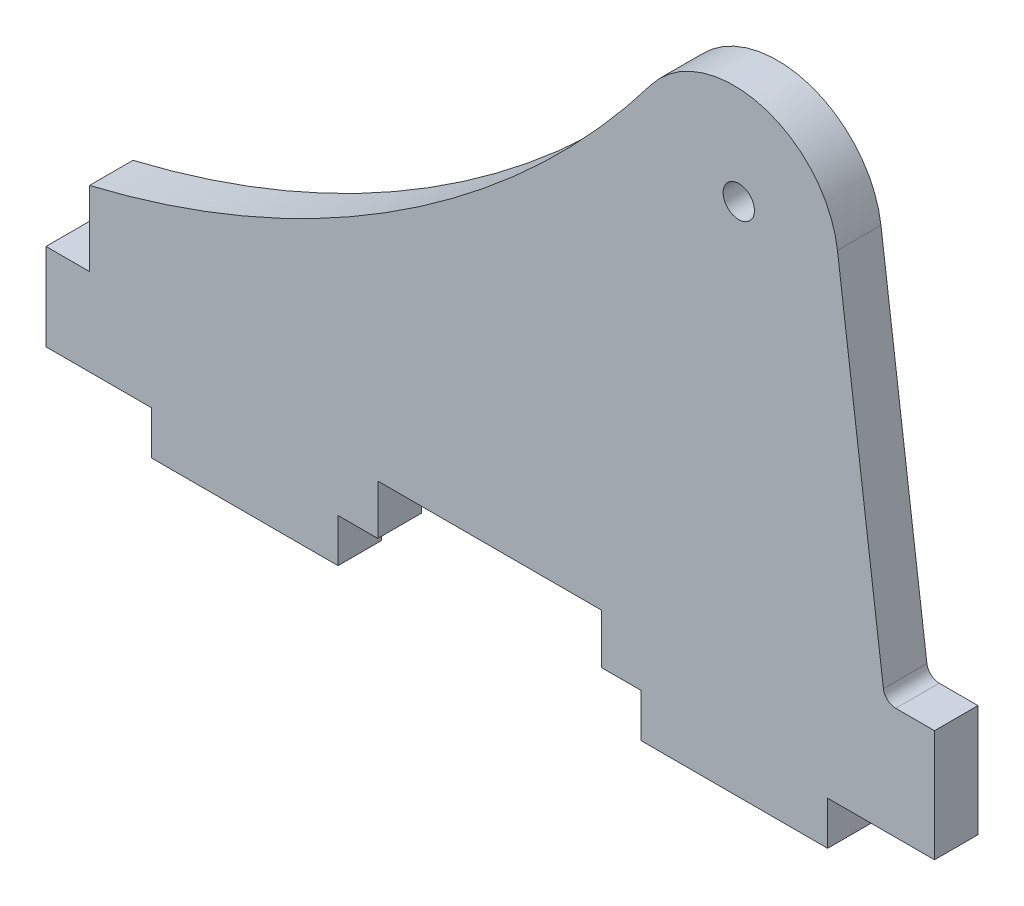
ISO-10303-21;
HEADER;
FILE_DESCRIPTION(('STEP AP214'),'2;1');
FILE_NAME('part.step','',(''),(''),'','','');
FILE_SCHEMA(('AUTOMOTIVE_DESIGN { 1 0 10303 214 1 1 1 1 }'));
ENDSEC;
DATA;
#1=APPLICATION_CONTEXT('core data for automotive mechanical design processes');
#2=APPLICATION_PROTOCOL_DEFINITION('international standard','automotive_design',2000,#1);
#3=PRODUCT_CONTEXT('',#1,'mechanical');
#4=PRODUCT('Part','Part','',(#3));
#5=PRODUCT_RELATED_PRODUCT_CATEGORY('part','',(#4));
#6=PRODUCT_DEFINITION_FORMATION('','',#4);
#7=PRODUCT_DEFINITION_CONTEXT('part definition',#1,'design');
#8=PRODUCT_DEFINITION('design','',#6,#7);
#9=PRODUCT_DEFINITION_SHAPE('','',#8);
#10=(LENGTH_UNIT() NAMED_UNIT(*) SI_UNIT(.MILLI.,.METRE.));
#11=(NAMED_UNIT(*) PLANE_ANGLE_UNIT() SI_UNIT($,.RADIAN.));
#12=(NAMED_UNIT(*) SI_UNIT($,.STERADIAN.) SOLID_ANGLE_UNIT());
#13=UNCERTAINTY_MEASURE_WITH_UNIT(LENGTH_MEASURE(1.E-05),#10,'distance_accuracy_value','');
#14=(GEOMETRIC_REPRESENTATION_CONTEXT(3) GLOBAL_UNCERTAINTY_ASSIGNED_CONTEXT((#13)) GLOBAL_UNIT_ASSIGNED_CONTEXT((#10,
#11,#12)) REPRESENTATION_CONTEXT('',''));
#15=CARTESIAN_POINT('',(0.,0.,0.));
#16=DIRECTION('',(0.,0.,1.));
#17=DIRECTION('',(1.,0.,0.));
#18=AXIS2_PLACEMENT_3D('',#15,#16,#17);
#19=CARTESIAN_POINT('',(0.,7.49999999999999,3.5));
#20=DIRECTION('',(0.,1.,0.));
#21=DIRECTION('',(-1.,0.,0.));
#22=AXIS2_PLACEMENT_3D('',#19,#20,#21);
#23=PLANE('',#22);
#24=DIRECTION('',(1.,0.,0.));
#25=VECTOR('',#24,1.);
#26=CARTESIAN_POINT('',(0.,7.49999999999999,0.));
#27=LINE('',#26,#25);
#28=CARTESIAN_POINT('',(26.7,7.5,0.));
#29=VERTEX_POINT('',#28);
#30=CARTESIAN_POINT('',(44.7,7.5,0.));
#31=VERTEX_POINT('',#30);
#32=EDGE_CURVE('E201',#29,#31,#27,.T.);
#33=ORIENTED_EDGE('',*,*,#32,.T.);
#34=DIRECTION('',(0.,0.,-1.));
#35=VECTOR('',#34,1.);
#36=CARTESIAN_POINT('',(44.7,7.5,3.5));
#37=LINE('',#36,#35);
#38=CARTESIAN_POINT('',(44.7,7.5,3.5));
#39=VERTEX_POINT('',#38);
#40=EDGE_CURVE('E199',#39,#31,#37,.T.);
#41=ORIENTED_EDGE('',*,*,#40,.F.);
#42=DIRECTION('',(1.,0.,0.));
#43=VECTOR('',#42,1.);
#44=CARTESIAN_POINT('',(0.,7.49999999999999,3.5));
#45=LINE('',#44,#43);
#46=CARTESIAN_POINT('',(26.7,7.5,3.5));
#47=VERTEX_POINT('',#46);
#48=EDGE_CURVE('E185',#47,#39,#45,.T.);
#49=ORIENTED_EDGE('',*,*,#48,.F.);
#50=DIRECTION('',(0.,0.,-1.));
#51=VECTOR('',#50,1.);
#52=CARTESIAN_POINT('',(26.7,7.5,3.5));
#53=LINE('',#52,#51);
#54=EDGE_CURVE('E255',#47,#29,#53,.T.);
#55=ORIENTED_EDGE('',*,*,#54,.T.);
#56=EDGE_LOOP('',(#33,#41,#49,#55));
#57=FACE_BOUND('',#56,.T.);
#58=ADVANCED_FACE('F36',(#57),#23,.F.);
#59=CARTESIAN_POINT('',(44.7,0.,3.5));
#60=DIRECTION('',(-1.,0.,0.));
#61=DIRECTION('',(0.,-1.,0.));
#62=AXIS2_PLACEMENT_3D('',#59,#60,#61);
#63=PLANE('',#62);
#64=DIRECTION('',(0.,1.,0.));
#65=VECTOR('',#64,1.);
#66=CARTESIAN_POINT('',(44.7,0.,0.));
#67=LINE('',#66,#65);
#68=CARTESIAN_POINT('',(44.7,3.5,0.));
#69=VERTEX_POINT('',#68);
#70=EDGE_CURVE('E257',#69,#31,#67,.T.);
#71=ORIENTED_EDGE('',*,*,#70,.F.);
#72=DIRECTION('',(0.,0.,-1.));
#73=VECTOR('',#72,1.);
#74=CARTESIAN_POINT('',(44.7,3.5,3.5));
#75=LINE('',#74,#73);
#76=CARTESIAN_POINT('',(44.7,3.5,3.5));
#77=VERTEX_POINT('',#76);
#78=EDGE_CURVE('E206',#77,#69,#75,.T.);
#79=ORIENTED_EDGE('',*,*,#78,.F.);
#80=DIRECTION('',(0.,1.,0.));
#81=VECTOR('',#80,1.);
#82=CARTESIAN_POINT('',(44.7,0.,3.5));
#83=LINE('',#82,#81);
#84=EDGE_CURVE('E190',#77,#39,#83,.T.);
#85=ORIENTED_EDGE('',*,*,#84,.T.);
#86=ORIENTED_EDGE('',*,*,#40,.T.);
#87=EDGE_LOOP('',(#71,#79,#85,#86));
#88=FACE_BOUND('',#87,.T.);
#89=ADVANCED_FACE('F208',(#88),#63,.T.);
#90=CARTESIAN_POINT('',(0.,3.5,3.5));
#91=DIRECTION('',(0.,1.,0.));
#92=DIRECTION('',(0.,0.,1.));
#93=AXIS2_PLACEMENT_3D('',#90,#91,#92);
#94=PLANE('',#93);
#95=DIRECTION('',(1.,0.,0.));
#96=VECTOR('',#95,1.);
#97=CARTESIAN_POINT('',(0.,3.5,0.));
#98=LINE('',#97,#96);
#99=CARTESIAN_POINT('',(47.9,3.5,0.));
#100=VERTEX_POINT('',#99);
#101=EDGE_CURVE('E259',#69,#100,#98,.T.);
#102=ORIENTED_EDGE('',*,*,#101,.T.);
#103=DIRECTION('',(0.,0.,-1.));
#104=VECTOR('',#103,1.);
#105=CARTESIAN_POINT('',(47.9,3.5,3.5));
#106=LINE('',#105,#104);
#107=CARTESIAN_POINT('',(47.9,3.5,3.5));
#108=VERTEX_POINT('',#107);
#109=EDGE_CURVE('E348',#108,#100,#106,.T.);
#110=ORIENTED_EDGE('',*,*,#109,.F.);
#111=DIRECTION('',(1.,0.,0.));
#112=VECTOR('',#111,1.);
#113=CARTESIAN_POINT('',(0.,3.5,3.5));
#114=LINE('',#113,#112);
#115=EDGE_CURVE('E210',#77,#108,#114,.T.);
#116=ORIENTED_EDGE('',*,*,#115,.F.);
#117=ORIENTED_EDGE('',*,*,#78,.T.);
#118=EDGE_LOOP('',(#102,#110,#116,#117));
#119=FACE_BOUND('',#118,.T.);
#120=ADVANCED_FACE('F380',(#119),#94,.F.);
#121=CARTESIAN_POINT('',(47.9,0.,3.5));
#122=DIRECTION('',(1.,0.,0.));
#123=DIRECTION('',(0.,0.,-1.));
#124=AXIS2_PLACEMENT_3D('',#121,#122,#123);
#125=PLANE('',#124);
#126=DIRECTION('',(0.,-1.,0.));
#127=VECTOR('',#126,1.);
#128=CARTESIAN_POINT('',(47.9,0.,0.));
#129=LINE('',#128,#127);
#130=CARTESIAN_POINT('',(47.9,0.,0.));
#131=VERTEX_POINT('',#130);
#132=EDGE_CURVE('E261',#100,#131,#129,.T.);
#133=ORIENTED_EDGE('',*,*,#132,.T.);
#134=DIRECTION('',(0.,0.,-1.));
#135=VECTOR('',#134,1.);
#136=CARTESIAN_POINT('',(47.9,0.,3.5));
#137=LINE('',#136,#135);
#138=CARTESIAN_POINT('',(47.9,0.,3.5));
#139=VERTEX_POINT('',#138);
#140=EDGE_CURVE('E345',#139,#131,#137,.T.);
#141=ORIENTED_EDGE('',*,*,#140,.F.);
#142=DIRECTION('',(0.,-1.,0.));
#143=VECTOR('',#142,1.);
#144=CARTESIAN_POINT('',(47.9,0.,3.5));
#145=LINE('',#144,#143);
#146=EDGE_CURVE('E212',#108,#139,#145,.T.);
#147=ORIENTED_EDGE('',*,*,#146,.F.);
#148=ORIENTED_EDGE('',*,*,#109,.T.);
#149=EDGE_LOOP('',(#133,#141,#147,#148));
#150=FACE_BOUND('',#149,.T.);
#151=ADVANCED_FACE('F385',(#150),#125,.F.);
#152=CARTESIAN_POINT('',(0.,0.,3.5));
#153=DIRECTION('',(0.,1.,0.));
#154=DIRECTION('',(0.,0.,1.));
#155=AXIS2_PLACEMENT_3D('',#152,#153,#154);
#156=PLANE('',#155);
#157=DIRECTION('',(1.,0.,0.));
#158=VECTOR('',#157,1.);
#159=CARTESIAN_POINT('',(0.,0.,0.));
#160=LINE('',#159,#158);
#161=CARTESIAN_POINT('',(62.9,0.,0.));
#162=VERTEX_POINT('',#161);
#163=EDGE_CURVE('E263',#131,#162,#160,.T.);
#164=ORIENTED_EDGE('',*,*,#163,.T.);
#165=DIRECTION('',(0.,0.,-1.));
#166=VECTOR('',#165,1.);
#167=CARTESIAN_POINT('',(62.9,0.,3.5));
#168=LINE('',#167,#166);
#169=CARTESIAN_POINT('',(62.9,0.,3.5));
#170=VERTEX_POINT('',#169);
#171=EDGE_CURVE('E342',#170,#162,#168,.T.);
#172=ORIENTED_EDGE('',*,*,#171,.F.);
#173=DIRECTION('',(1.,0.,0.));
#174=VECTOR('',#173,1.);
#175=CARTESIAN_POINT('',(0.,0.,3.5));
#176=LINE('',#175,#174);
#177=EDGE_CURVE('E216',#139,#170,#176,.T.);
#178=ORIENTED_EDGE('',*,*,#177,.F.);
#179=ORIENTED_EDGE('',*,*,#140,.T.);
#180=EDGE_LOOP('',(#164,#172,#178,#179));
#181=FACE_BOUND('',#180,.T.);
#182=ADVANCED_FACE('F389',(#181),#156,.F.);
#183=CARTESIAN_POINT('',(62.9,0.,3.5));
#184=DIRECTION('',(-1.,0.,0.));
#185=DIRECTION('',(0.,0.,1.));
#186=AXIS2_PLACEMENT_3D('',#183,#184,#185);
#187=PLANE('',#186);
#188=DIRECTION('',(0.,1.,0.));
#189=VECTOR('',#188,1.);
#190=CARTESIAN_POINT('',(62.9,0.,0.));
#191=LINE('',#190,#189);
#192=CARTESIAN_POINT('',(62.9,3.5,0.));
#193=VERTEX_POINT('',#192);
#194=EDGE_CURVE('E265',#162,#193,#191,.T.);
#195=ORIENTED_EDGE('',*,*,#194,.T.);
#196=DIRECTION('',(0.,0.,-1.));
#197=VECTOR('',#196,1.);
#198=CARTESIAN_POINT('',(62.9,3.5,3.5));
#199=LINE('',#198,#197);
#200=CARTESIAN_POINT('',(62.9,3.5,3.5));
#201=VERTEX_POINT('',#200);
#202=EDGE_CURVE('E339',#201,#193,#199,.T.);
#203=ORIENTED_EDGE('',*,*,#202,.F.);
#204=DIRECTION('',(0.,1.,0.));
#205=VECTOR('',#204,1.);
#206=CARTESIAN_POINT('',(62.9,0.,3.5));
#207=LINE('',#206,#205);
#208=EDGE_CURVE('E218',#170,#201,#207,.T.);
#209=ORIENTED_EDGE('',*,*,#208,.F.);
#210=ORIENTED_EDGE('',*,*,#171,.T.);
#211=EDGE_LOOP('',(#195,#203,#209,#210));
#212=FACE_BOUND('',#211,.T.);
#213=ADVANCED_FACE('F393',(#212),#187,.F.);
#214=CARTESIAN_POINT('',(0.,3.5,3.5));
#215=DIRECTION('',(0.,1.,0.));
#216=DIRECTION('',(0.,0.,1.));
#217=AXIS2_PLACEMENT_3D('',#214,#215,#216);
#218=PLANE('',#217);
#219=DIRECTION('',(1.,0.,0.));
#220=VECTOR('',#219,1.);
#221=CARTESIAN_POINT('',(0.,3.5,0.));
#222=LINE('',#221,#220);
#223=CARTESIAN_POINT('',(71.5,3.5,0.));
#224=VERTEX_POINT('',#223);
#225=EDGE_CURVE('E267',#193,#224,#222,.T.);
#226=ORIENTED_EDGE('',*,*,#225,.T.);
#227=DIRECTION('',(0.,0.,-1.));
#228=VECTOR('',#227,1.);
#229=CARTESIAN_POINT('',(71.5,3.5,3.5));
#230=LINE('',#229,#228);
#231=CARTESIAN_POINT('',(71.5,3.5,3.5));
#232=VERTEX_POINT('',#231);
#233=EDGE_CURVE('E336',#232,#224,#230,.T.);
#234=ORIENTED_EDGE('',*,*,#233,.F.);
#235=DIRECTION('',(1.,0.,0.));
#236=VECTOR('',#235,1.);
#237=CARTESIAN_POINT('',(0.,3.5,3.5));
#238=LINE('',#237,#236);
#239=EDGE_CURVE('E220',#201,#232,#238,.T.);
#240=ORIENTED_EDGE('',*,*,#239,.F.);
#241=ORIENTED_EDGE('',*,*,#202,.T.);
#242=EDGE_LOOP('',(#226,#234,#240,#241));
#243=FACE_BOUND('',#242,.T.);
#244=ADVANCED_FACE('F397',(#243),#218,.F.);
#245=CARTESIAN_POINT('',(71.5,0.,3.5));
#246=DIRECTION('',(-1.,0.,0.));
#247=DIRECTION('',(0.,0.,1.));
#248=AXIS2_PLACEMENT_3D('',#245,#246,#247);
#249=PLANE('',#248);
#250=DIRECTION('',(0.,1.,0.));
#251=VECTOR('',#250,1.);
#252=CARTESIAN_POINT('',(71.5,0.,0.));
#253=LINE('',#252,#251);
#254=CARTESIAN_POINT('',(71.5,12.5,0.));
#255=VERTEX_POINT('',#254);
#256=EDGE_CURVE('E269',#224,#255,#253,.T.);
#257=ORIENTED_EDGE('',*,*,#256,.T.);
#258=DIRECTION('',(0.,0.,-1.));
#259=VECTOR('',#258,1.);
#260=CARTESIAN_POINT('',(71.5,12.5,3.5));
#261=LINE('',#260,#259);
#262=CARTESIAN_POINT('',(71.5,12.5,3.5));
#263=VERTEX_POINT('',#262);
#264=EDGE_CURVE('E333',#263,#255,#261,.T.);
#265=ORIENTED_EDGE('',*,*,#264,.F.);
#266=DIRECTION('',(0.,1.,0.));
#267=VECTOR('',#266,1.);
#268=CARTESIAN_POINT('',(71.5,0.,3.5));
#269=LINE('',#268,#267);
#270=EDGE_CURVE('E222',#232,#263,#269,.T.);
#271=ORIENTED_EDGE('',*,*,#270,.F.);
#272=ORIENTED_EDGE('',*,*,#233,.T.);
#273=EDGE_LOOP('',(#257,#265,#271,#272));
#274=FACE_BOUND('',#273,.T.);
#275=ADVANCED_FACE('F401',(#274),#249,.F.);
#276=CARTESIAN_POINT('',(0.,12.5,3.5));
#277=DIRECTION('',(0.,-1.,0.));
#278=DIRECTION('',(0.,0.,-1.));
#279=AXIS2_PLACEMENT_3D('',#276,#277,#278);
#280=PLANE('',#279);
#281=DIRECTION('',(-1.,0.,0.));
#282=VECTOR('',#281,1.);
#283=CARTESIAN_POINT('',(0.,12.5,0.));
#284=LINE('',#283,#282);
#285=CARTESIAN_POINT('',(68.3794661772859,12.5,0.));
#286=VERTEX_POINT('',#285);
#287=EDGE_CURVE('E271',#255,#286,#284,.T.);
#288=ORIENTED_EDGE('',*,*,#287,.T.);
#289=DIRECTION('',(0.,0.,-1.));
#290=VECTOR('',#289,1.);
#291=CARTESIAN_POINT('',(68.3794661772859,12.5,3.5));
#292=LINE('',#291,#290);
#293=CARTESIAN_POINT('',(68.3794661772859,12.5,3.5));
#294=VERTEX_POINT('',#293);
#295=EDGE_CURVE('E51',#286,#294,#292,.F.);
#296=ORIENTED_EDGE('',*,*,#295,.T.);
#297=DIRECTION('',(-1.,0.,0.));
#298=VECTOR('',#297,1.);
#299=CARTESIAN_POINT('',(0.,12.5,3.5));
#300=LINE('',#299,#298);
#301=EDGE_CURVE('E224',#263,#294,#300,.T.);
#302=ORIENTED_EDGE('',*,*,#301,.F.);
#303=ORIENTED_EDGE('',*,*,#264,.T.);
#304=EDGE_LOOP('',(#288,#296,#302,#303));
#305=FACE_BOUND('',#304,.T.);
#306=ADVANCED_FACE('F405',(#305),#280,.F.);
#307=CARTESIAN_POINT('',(67.9822446696735,8.75567852598962,3.5));
#308=DIRECTION('',(-0.991807880517906,-0.127738514718855,0.));
#309=DIRECTION('',(0.127738514718855,-0.991807880517906,0.));
#310=AXIS2_PLACEMENT_3D('',#307,#308,#309);
#311=PLANE('',#310);
#312=DIRECTION('',(-0.127738514718855,0.991807880517906,0.));
#313=VECTOR('',#312,1.);
#314=CARTESIAN_POINT('',(67.9822446696735,8.75567852598962,3.5));
#315=LINE('',#314,#313);
#316=CARTESIAN_POINT('',(67.387658296768,13.3722614852811,3.5));
#317=VERTEX_POINT('',#316);
#318=CARTESIAN_POINT('',(63.6911861963504,42.0730035236384,3.5));
#319=VERTEX_POINT('',#318);
#320=EDGE_CURVE('E226',#317,#319,#315,.T.);
#321=ORIENTED_EDGE('',*,*,#320,.F.);
#322=DIRECTION('',(0.,0.,-1.));
#323=VECTOR('',#322,1.);
#324=CARTESIAN_POINT('',(67.387658296768,13.3722614852811,0.));
#325=LINE('',#324,#323);
#326=CARTESIAN_POINT('',(67.387658296768,13.3722614852811,0.));
#327=VERTEX_POINT('',#326);
#328=EDGE_CURVE('E205',#317,#327,#325,.T.);
#329=ORIENTED_EDGE('',*,*,#328,.T.);
#330=DIRECTION('',(-0.127738514718855,0.991807880517906,0.));
#331=VECTOR('',#330,1.);
#332=CARTESIAN_POINT('',(67.9822446696735,8.75567852598962,0.));
#333=LINE('',#332,#331);
#334=CARTESIAN_POINT('',(63.6911861963504,42.0730035236384,0.));
#335=VERTEX_POINT('',#334);
#336=EDGE_CURVE('E273',#327,#335,#333,.T.);
#337=ORIENTED_EDGE('',*,*,#336,.T.);
#338=DIRECTION('',(0.,0.,-1.));
#339=VECTOR('',#338,1.);
#340=CARTESIAN_POINT('',(63.6911861963504,42.0730035236384,3.5));
#341=LINE('',#340,#339);
#342=EDGE_CURVE('E330',#319,#335,#341,.T.);
#343=ORIENTED_EDGE('',*,*,#342,.F.);
#344=EDGE_LOOP('',(#321,#329,#337,#343));
#345=FACE_BOUND('',#344,.T.);
#346=ADVANCED_FACE('F357',(#345),#311,.F.);
#347=CARTESIAN_POINT('',(55.36,41.,3.5));
#348=DIRECTION('',(0.,0.,-1.));
#349=DIRECTION('',(-1.,0.,0.));
#350=AXIS2_PLACEMENT_3D('',#347,#348,#349);
#351=CYLINDRICAL_SURFACE('',#350,8.39999999999999);
#352=CARTESIAN_POINT('',(55.36,41.,0.));
#353=DIRECTION('',(0.,0.,1.));
#354=DIRECTION('',(1.,0.,0.));
#355=AXIS2_PLACEMENT_3D('',#352,#353,#354);
#356=CIRCLE('',#355,8.39999999999999);
#357=CARTESIAN_POINT('',(48.6579273357255,46.0638149652988,0.));
#358=VERTEX_POINT('',#357);
#359=EDGE_CURVE('E275',#335,#358,#356,.T.);
#360=ORIENTED_EDGE('',*,*,#359,.T.);
#361=DIRECTION('',(0.,0.,-1.));
#362=VECTOR('',#361,1.);
#363=CARTESIAN_POINT('',(48.6579273357255,46.0638149652988,3.5));
#364=LINE('',#363,#362);
#365=CARTESIAN_POINT('',(48.6579273357255,46.0638149652988,3.5));
#366=VERTEX_POINT('',#365);
#367=EDGE_CURVE('E328',#366,#358,#364,.T.);
#368=ORIENTED_EDGE('',*,*,#367,.F.);
#369=CARTESIAN_POINT('',(55.36,41.,3.5));
#370=DIRECTION('',(0.,0.,1.));
#371=DIRECTION('',(1.,0.,0.));
#372=AXIS2_PLACEMENT_3D('',#369,#370,#371);
#373=CIRCLE('',#372,8.39999999999999);
#374=EDGE_CURVE('E228',#319,#366,#373,.T.);
#375=ORIENTED_EDGE('',*,*,#374,.F.);
#376=ORIENTED_EDGE('',*,*,#342,.T.);
#377=EDGE_LOOP('',(#360,#368,#375,#376));
#378=FACE_BOUND('',#377,.T.);
#379=ADVANCED_FACE('F367',(#378),#351,.T.);
#380=CARTESIAN_POINT('',(-15.1713361335558,94.2906241586206,3.5));
#381=DIRECTION('',(0.,0.,-1.));
#382=DIRECTION('',(-1.,0.,0.));
#383=AXIS2_PLACEMENT_3D('',#380,#381,#382);
#384=CYLINDRICAL_SURFACE('',#383,80.);
#385=CARTESIAN_POINT('',(-15.1713361335558,94.2906241586206,0.));
#386=DIRECTION('',(0.,0.,1.));
#387=DIRECTION('',(1.,0.,0.));
#388=AXIS2_PLACEMENT_3D('',#385,#386,#387);
#389=CIRCLE('',#388,80.);
#390=CARTESIAN_POINT('',(3.5,16.5,0.));
#391=VERTEX_POINT('',#390);
#392=EDGE_CURVE('E278',#391,#358,#389,.T.);
#393=ORIENTED_EDGE('',*,*,#392,.F.);
#394=DIRECTION('',(0.,0.,-1.));
#395=VECTOR('',#394,1.);
#396=CARTESIAN_POINT('',(3.5,16.5,3.5));
#397=LINE('',#396,#395);
#398=CARTESIAN_POINT('',(3.5,16.5,3.5));
#399=VERTEX_POINT('',#398);
#400=EDGE_CURVE('E326',#399,#391,#397,.T.);
#401=ORIENTED_EDGE('',*,*,#400,.F.);
#402=CARTESIAN_POINT('',(-15.1713361335558,94.2906241586206,3.5));
#403=DIRECTION('',(0.,0.,1.));
#404=DIRECTION('',(1.,0.,0.));
#405=AXIS2_PLACEMENT_3D('',#402,#403,#404);
#406=CIRCLE('',#405,80.);
#407=EDGE_CURVE('E230',#399,#366,#406,.T.);
#408=ORIENTED_EDGE('',*,*,#407,.T.);
#409=ORIENTED_EDGE('',*,*,#367,.T.);
#410=EDGE_LOOP('',(#393,#401,#408,#409));
#411=FACE_BOUND('',#410,.T.);
#412=ADVANCED_FACE('F413',(#411),#384,.F.);
#413=CARTESIAN_POINT('',(3.5,0.,3.5));
#414=DIRECTION('',(-1.,0.,0.));
#415=DIRECTION('',(0.,0.,1.));
#416=AXIS2_PLACEMENT_3D('',#413,#414,#415);
#417=PLANE('',#416);
#418=DIRECTION('',(0.,1.,0.));
#419=VECTOR('',#418,1.);
#420=CARTESIAN_POINT('',(3.5,0.,0.));
#421=LINE('',#420,#419);
#422=CARTESIAN_POINT('',(3.5,10.5,0.));
#423=VERTEX_POINT('',#422);
#424=EDGE_CURVE('E281',#423,#391,#421,.T.);
#425=ORIENTED_EDGE('',*,*,#424,.F.);
#426=DIRECTION('',(0.,0.,-1.));
#427=VECTOR('',#426,1.);
#428=CARTESIAN_POINT('',(3.5,10.5,3.5));
#429=LINE('',#428,#427);
#430=CARTESIAN_POINT('',(3.5,10.5,3.5));
#431=VERTEX_POINT('',#430);
#432=EDGE_CURVE('E324',#431,#423,#429,.T.);
#433=ORIENTED_EDGE('',*,*,#432,.F.);
#434=DIRECTION('',(0.,1.,0.));
#435=VECTOR('',#434,1.);
#436=CARTESIAN_POINT('',(3.5,0.,3.5));
#437=LINE('',#436,#435);
#438=EDGE_CURVE('E233',#431,#399,#437,.T.);
#439=ORIENTED_EDGE('',*,*,#438,.T.);
#440=ORIENTED_EDGE('',*,*,#400,.T.);
#441=EDGE_LOOP('',(#425,#433,#439,#440));
#442=FACE_BOUND('',#441,.T.);
#443=ADVANCED_FACE('F416',(#442),#417,.T.);
#444=CARTESIAN_POINT('',(0.,10.5,3.5));
#445=DIRECTION('',(0.,1.,0.));
#446=DIRECTION('',(0.,0.,1.));
#447=AXIS2_PLACEMENT_3D('',#444,#445,#446);
#448=PLANE('',#447);
#449=DIRECTION('',(1.,0.,0.));
#450=VECTOR('',#449,1.);
#451=CARTESIAN_POINT('',(0.,10.5,0.));
#452=LINE('',#451,#450);
#453=CARTESIAN_POINT('',(0.,10.5,0.));
#454=VERTEX_POINT('',#453);
#455=EDGE_CURVE('E284',#454,#423,#452,.T.);
#456=ORIENTED_EDGE('',*,*,#455,.F.);
#457=DIRECTION('',(0.,0.,-1.));
#458=VECTOR('',#457,1.);
#459=CARTESIAN_POINT('',(0.,10.5,3.5));
#460=LINE('',#459,#458);
#461=CARTESIAN_POINT('',(0.,10.5,3.5));
#462=VERTEX_POINT('',#461);
#463=EDGE_CURVE('E322',#462,#454,#460,.T.);
#464=ORIENTED_EDGE('',*,*,#463,.F.);
#465=DIRECTION('',(1.,0.,0.));
#466=VECTOR('',#465,1.);
#467=CARTESIAN_POINT('',(0.,10.5,3.5));
#468=LINE('',#467,#466);
#469=EDGE_CURVE('E236',#462,#431,#468,.T.);
#470=ORIENTED_EDGE('',*,*,#469,.T.);
#471=ORIENTED_EDGE('',*,*,#432,.T.);
#472=EDGE_LOOP('',(#456,#464,#470,#471));
#473=FACE_BOUND('',#472,.T.);
#474=ADVANCED_FACE('F420',(#473),#448,.T.);
#475=CARTESIAN_POINT('',(0.,0.,3.5));
#476=DIRECTION('',(1.,0.,0.));
#477=DIRECTION('',(0.,1.,0.));
#478=AXIS2_PLACEMENT_3D('',#475,#476,#477);
#479=PLANE('',#478);
#480=DIRECTION('',(0.,-1.,0.));
#481=VECTOR('',#480,1.);
#482=CARTESIAN_POINT('',(0.,0.,0.));
#483=LINE('',#482,#481);
#484=CARTESIAN_POINT('',(0.,3.5,0.));
#485=VERTEX_POINT('',#484);
#486=EDGE_CURVE('E287',#454,#485,#483,.T.);
#487=ORIENTED_EDGE('',*,*,#486,.T.);
#488=DIRECTION('',(0.,0.,-1.));
#489=VECTOR('',#488,1.);
#490=CARTESIAN_POINT('',(0.,3.5,3.5));
#491=LINE('',#490,#489);
#492=CARTESIAN_POINT('',(0.,3.5,3.5));
#493=VERTEX_POINT('',#492);
#494=EDGE_CURVE('E319',#493,#485,#491,.T.);
#495=ORIENTED_EDGE('',*,*,#494,.F.);
#496=DIRECTION('',(0.,-1.,0.));
#497=VECTOR('',#496,1.);
#498=CARTESIAN_POINT('',(0.,0.,3.5));
#499=LINE('',#498,#497);
#500=EDGE_CURVE('E239',#462,#493,#499,.T.);
#501=ORIENTED_EDGE('',*,*,#500,.F.);
#502=ORIENTED_EDGE('',*,*,#463,.T.);
#503=EDGE_LOOP('',(#487,#495,#501,#502));
#504=FACE_BOUND('',#503,.T.);
#505=ADVANCED_FACE('F424',(#504),#479,.F.);
#506=CARTESIAN_POINT('',(0.,3.5,3.5));
#507=DIRECTION('',(0.,1.,0.));
#508=DIRECTION('',(0.,0.,1.));
#509=AXIS2_PLACEMENT_3D('',#506,#507,#508);
#510=PLANE('',#509);
#511=DIRECTION('',(1.,0.,0.));
#512=VECTOR('',#511,1.);
#513=CARTESIAN_POINT('',(0.,3.5,0.));
#514=LINE('',#513,#512);
#515=CARTESIAN_POINT('',(8.5,3.5,0.));
#516=VERTEX_POINT('',#515);
#517=EDGE_CURVE('E289',#485,#516,#514,.T.);
#518=ORIENTED_EDGE('',*,*,#517,.T.);
#519=DIRECTION('',(0.,0.,-1.));
#520=VECTOR('',#519,1.);
#521=CARTESIAN_POINT('',(8.5,3.5,3.5));
#522=LINE('',#521,#520);
#523=CARTESIAN_POINT('',(8.5,3.5,3.5));
#524=VERTEX_POINT('',#523);
#525=EDGE_CURVE('E316',#524,#516,#522,.T.);
#526=ORIENTED_EDGE('',*,*,#525,.F.);
#527=DIRECTION('',(1.,0.,0.));
#528=VECTOR('',#527,1.);
#529=CARTESIAN_POINT('',(0.,3.5,3.5));
#530=LINE('',#529,#528);
#531=EDGE_CURVE('E241',#493,#524,#530,.T.);
#532=ORIENTED_EDGE('',*,*,#531,.F.);
#533=ORIENTED_EDGE('',*,*,#494,.T.);
#534=EDGE_LOOP('',(#518,#526,#532,#533));
#535=FACE_BOUND('',#534,.T.);
#536=ADVANCED_FACE('F428',(#535),#510,.F.);
#537=CARTESIAN_POINT('',(8.5,0.,3.5));
#538=DIRECTION('',(1.,0.,0.));
#539=DIRECTION('',(0.,0.,-1.));
#540=AXIS2_PLACEMENT_3D('',#537,#538,#539);
#541=PLANE('',#540);
#542=DIRECTION('',(0.,-1.,0.));
#543=VECTOR('',#542,1.);
#544=CARTESIAN_POINT('',(8.5,0.,0.));
#545=LINE('',#544,#543);
#546=CARTESIAN_POINT('',(8.5,0.,0.));
#547=VERTEX_POINT('',#546);
#548=EDGE_CURVE('E291',#516,#547,#545,.T.);
#549=ORIENTED_EDGE('',*,*,#548,.T.);
#550=DIRECTION('',(0.,0.,-1.));
#551=VECTOR('',#550,1.);
#552=CARTESIAN_POINT('',(8.5,0.,3.5));
#553=LINE('',#552,#551);
#554=CARTESIAN_POINT('',(8.5,0.,3.5));
#555=VERTEX_POINT('',#554);
#556=EDGE_CURVE('E313',#555,#547,#553,.T.);
#557=ORIENTED_EDGE('',*,*,#556,.F.);
#558=DIRECTION('',(0.,-1.,0.));
#559=VECTOR('',#558,1.);
#560=CARTESIAN_POINT('',(8.5,0.,3.5));
#561=LINE('',#560,#559);
#562=EDGE_CURVE('E243',#524,#555,#561,.T.);
#563=ORIENTED_EDGE('',*,*,#562,.F.);
#564=ORIENTED_EDGE('',*,*,#525,.T.);
#565=EDGE_LOOP('',(#549,#557,#563,#564));
#566=FACE_BOUND('',#565,.T.);
#567=ADVANCED_FACE('F432',(#566),#541,.F.);
#568=CARTESIAN_POINT('',(0.,0.,3.5));
#569=DIRECTION('',(0.,1.,0.));
#570=DIRECTION('',(0.,0.,1.));
#571=AXIS2_PLACEMENT_3D('',#568,#569,#570);
#572=PLANE('',#571);
#573=DIRECTION('',(1.,0.,0.));
#574=VECTOR('',#573,1.);
#575=CARTESIAN_POINT('',(0.,0.,0.));
#576=LINE('',#575,#574);
#577=CARTESIAN_POINT('',(23.5,0.,0.));
#578=VERTEX_POINT('',#577);
#579=EDGE_CURVE('E293',#547,#578,#576,.T.);
#580=ORIENTED_EDGE('',*,*,#579,.T.);
#581=DIRECTION('',(0.,0.,-1.));
#582=VECTOR('',#581,1.);
#583=CARTESIAN_POINT('',(23.5,0.,3.5));
#584=LINE('',#583,#582);
#585=CARTESIAN_POINT('',(23.5,0.,3.5));
#586=VERTEX_POINT('',#585);
#587=EDGE_CURVE('E310',#586,#578,#584,.T.);
#588=ORIENTED_EDGE('',*,*,#587,.F.);
#589=DIRECTION('',(1.,0.,0.));
#590=VECTOR('',#589,1.);
#591=CARTESIAN_POINT('',(0.,0.,3.5));
#592=LINE('',#591,#590);
#593=EDGE_CURVE('E245',#555,#586,#592,.T.);
#594=ORIENTED_EDGE('',*,*,#593,.F.);
#595=ORIENTED_EDGE('',*,*,#556,.T.);
#596=EDGE_LOOP('',(#580,#588,#594,#595));
#597=FACE_BOUND('',#596,.T.);
#598=ADVANCED_FACE('F436',(#597),#572,.F.);
#599=CARTESIAN_POINT('',(23.5,0.,3.5));
#600=DIRECTION('',(-1.,0.,0.));
#601=DIRECTION('',(0.,-1.,0.));
#602=AXIS2_PLACEMENT_3D('',#599,#600,#601);
#603=PLANE('',#602);
#604=DIRECTION('',(0.,1.,0.));
#605=VECTOR('',#604,1.);
#606=CARTESIAN_POINT('',(23.5,0.,0.));
#607=LINE('',#606,#605);
#608=CARTESIAN_POINT('',(23.5,3.5,0.));
#609=VERTEX_POINT('',#608);
#610=EDGE_CURVE('E295',#578,#609,#607,.T.);
#611=ORIENTED_EDGE('',*,*,#610,.T.);
#612=DIRECTION('',(0.,0.,-1.));
#613=VECTOR('',#612,1.);
#614=CARTESIAN_POINT('',(23.5,3.5,3.5));
#615=LINE('',#614,#613);
#616=CARTESIAN_POINT('',(23.5,3.5,3.5));
#617=VERTEX_POINT('',#616);
#618=EDGE_CURVE('E307',#617,#609,#615,.T.);
#619=ORIENTED_EDGE('',*,*,#618,.F.);
#620=DIRECTION('',(0.,1.,0.));
#621=VECTOR('',#620,1.);
#622=CARTESIAN_POINT('',(23.5,0.,3.5));
#623=LINE('',#622,#621);
#624=EDGE_CURVE('E247',#586,#617,#623,.T.);
#625=ORIENTED_EDGE('',*,*,#624,.F.);
#626=ORIENTED_EDGE('',*,*,#587,.T.);
#627=EDGE_LOOP('',(#611,#619,#625,#626));
#628=FACE_BOUND('',#627,.T.);
#629=ADVANCED_FACE('F440',(#628),#603,.F.);
#630=CARTESIAN_POINT('',(0.,3.5,3.5));
#631=DIRECTION('',(0.,1.,0.));
#632=DIRECTION('',(0.,0.,1.));
#633=AXIS2_PLACEMENT_3D('',#630,#631,#632);
#634=PLANE('',#633);
#635=DIRECTION('',(1.,0.,0.));
#636=VECTOR('',#635,1.);
#637=CARTESIAN_POINT('',(0.,3.5,0.));
#638=LINE('',#637,#636);
#639=CARTESIAN_POINT('',(26.7,3.5,0.));
#640=VERTEX_POINT('',#639);
#641=EDGE_CURVE('E297',#609,#640,#638,.T.);
#642=ORIENTED_EDGE('',*,*,#641,.T.);
#643=DIRECTION('',(0.,0.,-1.));
#644=VECTOR('',#643,1.);
#645=CARTESIAN_POINT('',(26.7,3.5,3.5));
#646=LINE('',#645,#644);
#647=CARTESIAN_POINT('',(26.7,3.5,3.5));
#648=VERTEX_POINT('',#647);
#649=EDGE_CURVE('E304',#648,#640,#646,.T.);
#650=ORIENTED_EDGE('',*,*,#649,.F.);
#651=DIRECTION('',(1.,0.,0.));
#652=VECTOR('',#651,1.);
#653=CARTESIAN_POINT('',(0.,3.5,3.5));
#654=LINE('',#653,#652);
#655=EDGE_CURVE('E249',#617,#648,#654,.T.);
#656=ORIENTED_EDGE('',*,*,#655,.F.);
#657=ORIENTED_EDGE('',*,*,#618,.T.);
#658=EDGE_LOOP('',(#642,#650,#656,#657));
#659=FACE_BOUND('',#658,.T.);
#660=ADVANCED_FACE('F444',(#659),#634,.F.);
#661=CARTESIAN_POINT('',(26.7,0.,3.5));
#662=DIRECTION('',(-1.,0.,0.));
#663=DIRECTION('',(0.,0.,1.));
#664=AXIS2_PLACEMENT_3D('',#661,#662,#663);
#665=PLANE('',#664);
#666=DIRECTION('',(0.,1.,0.));
#667=VECTOR('',#666,1.);
#668=CARTESIAN_POINT('',(26.7,0.,0.));
#669=LINE('',#668,#667);
#670=EDGE_CURVE('E299',#640,#29,#669,.T.);
#671=ORIENTED_EDGE('',*,*,#670,.T.);
#672=ORIENTED_EDGE('',*,*,#54,.F.);
#673=DIRECTION('',(0.,1.,0.));
#674=VECTOR('',#673,1.);
#675=CARTESIAN_POINT('',(26.7,0.,3.5));
#676=LINE('',#675,#674);
#677=EDGE_CURVE('E192',#648,#47,#676,.T.);
#678=ORIENTED_EDGE('',*,*,#677,.F.);
#679=ORIENTED_EDGE('',*,*,#649,.T.);
#680=EDGE_LOOP('',(#671,#672,#678,#679));
#681=FACE_BOUND('',#680,.T.);
#682=ADVANCED_FACE('F448',(#681),#665,.F.);
#683=CARTESIAN_POINT('',(55.75,41.5,3.5));
#684=DIRECTION('',(0.,0.,-1.));
#685=DIRECTION('',(-1.,0.,0.));
#686=AXIS2_PLACEMENT_3D('',#683,#684,#685);
#687=CYLINDRICAL_SURFACE('',#686,1.25999999970977);
#688=CARTESIAN_POINT('',(55.75,41.5,3.5));
#689=DIRECTION('',(0.,0.,1.));
#690=DIRECTION('',(1.,0.,0.));
#691=AXIS2_PLACEMENT_3D('',#688,#689,#690);
#692=CIRCLE('',#691,1.25999999970977);
#693=CARTESIAN_POINT('',(57.0099999997098,41.5,3.5));
#694=VERTEX_POINT('',#693);
#695=EDGE_CURVE('E252',#694,#694,#692,.T.);
#696=ORIENTED_EDGE('',*,*,#695,.T.);
#697=EDGE_LOOP('',(#696));
#698=FACE_BOUND('',#697,.T.);
#699=CARTESIAN_POINT('',(55.75,41.5,0.));
#700=DIRECTION('',(0.,0.,1.));
#701=DIRECTION('',(1.,0.,0.));
#702=AXIS2_PLACEMENT_3D('',#699,#700,#701);
#703=CIRCLE('',#702,1.25999999970977);
#704=CARTESIAN_POINT('',(57.0099999997098,41.5,0.));
#705=VERTEX_POINT('',#704);
#706=EDGE_CURVE('E196',#705,#705,#703,.T.);
#707=ORIENTED_EDGE('',*,*,#706,.F.);
#708=EDGE_LOOP('',(#707));
#709=FACE_BOUND('',#708,.T.);
#710=ADVANCED_FACE('F452',(#698,#709),#687,.F.);
#711=CARTESIAN_POINT('',(0.,0.,3.5));
#712=DIRECTION('',(0.,0.,1.));
#713=DIRECTION('',(1.,0.,0.));
#714=AXIS2_PLACEMENT_3D('',#711,#712,#713);
#715=PLANE('',#714);
#716=ORIENTED_EDGE('',*,*,#48,.T.);
#717=ORIENTED_EDGE('',*,*,#84,.F.);
#718=ORIENTED_EDGE('',*,*,#115,.T.);
#719=ORIENTED_EDGE('',*,*,#146,.T.);
#720=ORIENTED_EDGE('',*,*,#177,.T.);
#721=ORIENTED_EDGE('',*,*,#208,.T.);
#722=ORIENTED_EDGE('',*,*,#239,.T.);
#723=ORIENTED_EDGE('',*,*,#270,.T.);
#724=ORIENTED_EDGE('',*,*,#301,.T.);
#725=CARTESIAN_POINT('',(68.3794661772859,13.5,3.5));
#726=DIRECTION('',(0.,0.,1.));
#727=DIRECTION('',(1.,0.,0.));
#728=AXIS2_PLACEMENT_3D('',#725,#726,#727);
#729=CIRCLE('',#728,1.);
#730=EDGE_CURVE('E11',#294,#317,#729,.F.);
#731=ORIENTED_EDGE('',*,*,#730,.T.);
#732=ORIENTED_EDGE('',*,*,#320,.T.);
#733=ORIENTED_EDGE('',*,*,#374,.T.);
#734=ORIENTED_EDGE('',*,*,#407,.F.);
#735=ORIENTED_EDGE('',*,*,#438,.F.);
#736=ORIENTED_EDGE('',*,*,#469,.F.);
#737=ORIENTED_EDGE('',*,*,#500,.T.);
#738=ORIENTED_EDGE('',*,*,#531,.T.);
#739=ORIENTED_EDGE('',*,*,#562,.T.);
#740=ORIENTED_EDGE('',*,*,#593,.T.);
#741=ORIENTED_EDGE('',*,*,#624,.T.);
#742=ORIENTED_EDGE('',*,*,#655,.T.);
#743=ORIENTED_EDGE('',*,*,#677,.T.);
#744=EDGE_LOOP('',(#716,#717,#718,#719,#720,#721,#722,#723,#724,#731,#732,#733,#734,#735,#736,
#737,#738,#739,#740,#741,#742,#743));
#745=FACE_BOUND('',#744,.T.);
#746=ORIENTED_EDGE('',*,*,#695,.F.);
#747=EDGE_LOOP('',(#746));
#748=FACE_BOUND('',#747,.T.);
#749=ADVANCED_FACE('F187',(#745,#748),#715,.T.);
#750=CARTESIAN_POINT('',(0.,0.,0.));
#751=DIRECTION('',(0.,0.,1.));
#752=DIRECTION('',(1.,0.,0.));
#753=AXIS2_PLACEMENT_3D('',#750,#751,#752);
#754=PLANE('',#753);
#755=ORIENTED_EDGE('',*,*,#32,.F.);
#756=ORIENTED_EDGE('',*,*,#670,.F.);
#757=ORIENTED_EDGE('',*,*,#641,.F.);
#758=ORIENTED_EDGE('',*,*,#610,.F.);
#759=ORIENTED_EDGE('',*,*,#579,.F.);
#760=ORIENTED_EDGE('',*,*,#548,.F.);
#761=ORIENTED_EDGE('',*,*,#517,.F.);
#762=ORIENTED_EDGE('',*,*,#486,.F.);
#763=ORIENTED_EDGE('',*,*,#455,.T.);
#764=ORIENTED_EDGE('',*,*,#424,.T.);
#765=ORIENTED_EDGE('',*,*,#392,.T.);
#766=ORIENTED_EDGE('',*,*,#359,.F.);
#767=ORIENTED_EDGE('',*,*,#336,.F.);
#768=CARTESIAN_POINT('',(68.3794661772859,13.5,0.));
#769=DIRECTION('',(0.,0.,1.));
#770=DIRECTION('',(1.,0.,0.));
#771=AXIS2_PLACEMENT_3D('',#768,#769,#770);
#772=CIRCLE('',#771,1.);
#773=EDGE_CURVE('E44',#327,#286,#772,.T.);
#774=ORIENTED_EDGE('',*,*,#773,.T.);
#775=ORIENTED_EDGE('',*,*,#287,.F.);
#776=ORIENTED_EDGE('',*,*,#256,.F.);
#777=ORIENTED_EDGE('',*,*,#225,.F.);
#778=ORIENTED_EDGE('',*,*,#194,.F.);
#779=ORIENTED_EDGE('',*,*,#163,.F.);
#780=ORIENTED_EDGE('',*,*,#132,.F.);
#781=ORIENTED_EDGE('',*,*,#101,.F.);
#782=ORIENTED_EDGE('',*,*,#70,.T.);
#783=EDGE_LOOP('',(#755,#756,#757,#758,#759,#760,#761,#762,#763,#764,#765,#766,#767,#774,#775,
#776,#777,#778,#779,#780,#781,#782));
#784=FACE_BOUND('',#783,.T.);
#785=ORIENTED_EDGE('',*,*,#706,.T.);
#786=EDGE_LOOP('',(#785));
#787=FACE_BOUND('',#786,.T.);
#788=ADVANCED_FACE('F362',(#784,#787),#754,.F.);
#789=CARTESIAN_POINT('',(68.3794661772859,13.5,3.5));
#790=DIRECTION('',(0.,0.,1.));
#791=DIRECTION('',(1.,0.,0.));
#792=AXIS2_PLACEMENT_3D('',#789,#790,#791);
#793=CYLINDRICAL_SURFACE('',#792,1.);
#794=ORIENTED_EDGE('',*,*,#730,.F.);
#795=ORIENTED_EDGE('',*,*,#295,.F.);
#796=ORIENTED_EDGE('',*,*,#773,.F.);
#797=ORIENTED_EDGE('',*,*,#328,.F.);
#798=EDGE_LOOP('',(#794,#795,#796,#797));
#799=FACE_BOUND('',#798,.T.);
#800=ADVANCED_FACE('F38',(#799),#793,.F.);
#801=CLOSED_SHELL('',(#58,#89,#120,#151,#182,#213,#244,#275,#306,#346,#379,#412,#443,#474,#505,
#536,#567,#598,#629,#660,#682,#710,#749,#788,#800));
#802=MANIFOLD_SOLID_BREP('B2',#801);
#803=ADVANCED_BREP_SHAPE_REPRESENTATION('',(#18,#802),#14);
#804=SHAPE_DEFINITION_REPRESENTATION(#9,#803);
ENDSEC;
END-ISO-10303-21;
